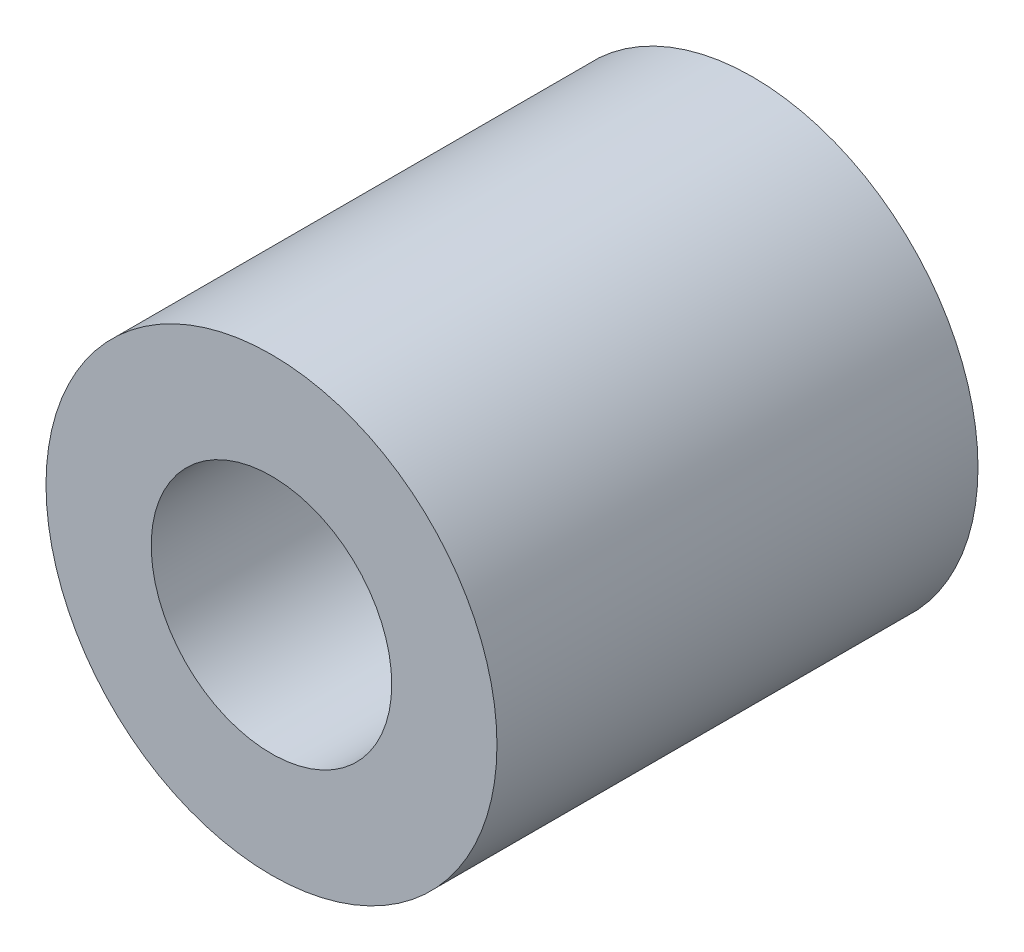
ISO-10303-21;
HEADER;
FILE_DESCRIPTION(('STEP AP214'),'2;1');
FILE_NAME('part.step','',(''),(''),'','','');
FILE_SCHEMA(('AUTOMOTIVE_DESIGN { 1 0 10303 214 1 1 1 1 }'));
ENDSEC;
DATA;
#1=APPLICATION_CONTEXT('core data for automotive mechanical design processes');
#2=APPLICATION_PROTOCOL_DEFINITION('international standard','automotive_design',2000,#1);
#3=PRODUCT_CONTEXT('',#1,'mechanical');
#4=PRODUCT('Part','Part','',(#3));
#5=PRODUCT_RELATED_PRODUCT_CATEGORY('part','',(#4));
#6=PRODUCT_DEFINITION_FORMATION('','',#4);
#7=PRODUCT_DEFINITION_CONTEXT('part definition',#1,'design');
#8=PRODUCT_DEFINITION('design','',#6,#7);
#9=PRODUCT_DEFINITION_SHAPE('','',#8);
#10=(LENGTH_UNIT() NAMED_UNIT(*) SI_UNIT(.MILLI.,.METRE.));
#11=(NAMED_UNIT(*) PLANE_ANGLE_UNIT() SI_UNIT($,.RADIAN.));
#12=(NAMED_UNIT(*) SI_UNIT($,.STERADIAN.) SOLID_ANGLE_UNIT());
#13=UNCERTAINTY_MEASURE_WITH_UNIT(LENGTH_MEASURE(1.E-05),#10,'distance_accuracy_value','');
#14=(GEOMETRIC_REPRESENTATION_CONTEXT(3) GLOBAL_UNCERTAINTY_ASSIGNED_CONTEXT((#13)) GLOBAL_UNIT_ASSIGNED_CONTEXT((#10,
#11,#12)) REPRESENTATION_CONTEXT('',''));
#15=CARTESIAN_POINT('',(0.,0.,0.));
#16=DIRECTION('',(0.,0.,1.));
#17=DIRECTION('',(1.,0.,0.));
#18=AXIS2_PLACEMENT_3D('',#15,#16,#17);
#19=CARTESIAN_POINT('',(0.,0.,16.));
#20=DIRECTION('',(0.,0.,1.));
#21=DIRECTION('',(1.,0.,0.));
#22=AXIS2_PLACEMENT_3D('',#19,#20,#21);
#23=PLANE('',#22);
#24=CARTESIAN_POINT('',(0.,0.,16.));
#25=DIRECTION('',(0.,0.,1.));
#26=DIRECTION('',(1.,0.,0.));
#27=AXIS2_PLACEMENT_3D('',#24,#25,#26);
#28=CIRCLE('',#27,7.5);
#29=CARTESIAN_POINT('',(7.5,0.,16.));
#30=VERTEX_POINT('',#29);
#31=EDGE_CURVE('E10',#30,#30,#28,.T.);
#32=ORIENTED_EDGE('',*,*,#31,.T.);
#33=EDGE_LOOP('',(#32));
#34=FACE_BOUND('',#33,.T.);
#35=CARTESIAN_POINT('',(0.,0.,16.));
#36=DIRECTION('',(0.,0.,1.));
#37=DIRECTION('',(1.,0.,0.));
#38=AXIS2_PLACEMENT_3D('',#35,#36,#37);
#39=CIRCLE('',#38,4.);
#40=CARTESIAN_POINT('',(4.,0.,16.));
#41=VERTEX_POINT('',#40);
#42=EDGE_CURVE('E45',#41,#41,#39,.T.);
#43=ORIENTED_EDGE('',*,*,#42,.F.);
#44=EDGE_LOOP('',(#43));
#45=FACE_BOUND('',#44,.T.);
#46=ADVANCED_FACE('F34',(#34,#45),#23,.T.);
#47=CARTESIAN_POINT('',(0.,0.,0.));
#48=DIRECTION('',(0.,0.,1.));
#49=DIRECTION('',(1.,0.,0.));
#50=AXIS2_PLACEMENT_3D('',#47,#48,#49);
#51=PLANE('',#50);
#52=CARTESIAN_POINT('',(0.,0.,0.));
#53=DIRECTION('',(0.,0.,1.));
#54=DIRECTION('',(1.,0.,0.));
#55=AXIS2_PLACEMENT_3D('',#52,#53,#54);
#56=CIRCLE('',#55,7.5);
#57=CARTESIAN_POINT('',(7.5,0.,0.));
#58=VERTEX_POINT('',#57);
#59=EDGE_CURVE('E38',#58,#58,#56,.T.);
#60=ORIENTED_EDGE('',*,*,#59,.F.);
#61=EDGE_LOOP('',(#60));
#62=FACE_BOUND('',#61,.T.);
#63=CARTESIAN_POINT('',(0.,0.,0.));
#64=DIRECTION('',(0.,0.,1.));
#65=DIRECTION('',(1.,0.,0.));
#66=AXIS2_PLACEMENT_3D('',#63,#64,#65);
#67=CIRCLE('',#66,4.);
#68=CARTESIAN_POINT('',(4.,0.,0.));
#69=VERTEX_POINT('',#68);
#70=EDGE_CURVE('E47',#69,#69,#67,.T.);
#71=ORIENTED_EDGE('',*,*,#70,.T.);
#72=EDGE_LOOP('',(#71));
#73=FACE_BOUND('',#72,.T.);
#74=ADVANCED_FACE('F57',(#62,#73),#51,.F.);
#75=CARTESIAN_POINT('',(0.,0.,16.));
#76=DIRECTION('',(0.,0.,-1.));
#77=DIRECTION('',(-1.,0.,0.));
#78=AXIS2_PLACEMENT_3D('',#75,#76,#77);
#79=CYLINDRICAL_SURFACE('',#78,7.5);
#80=ORIENTED_EDGE('',*,*,#31,.F.);
#81=EDGE_LOOP('',(#80));
#82=FACE_BOUND('',#81,.T.);
#83=ORIENTED_EDGE('',*,*,#59,.T.);
#84=EDGE_LOOP('',(#83));
#85=FACE_BOUND('',#84,.T.);
#86=ADVANCED_FACE('F36',(#82,#85),#79,.T.);
#87=CARTESIAN_POINT('',(0.,0.,16.));
#88=DIRECTION('',(0.,0.,-1.));
#89=DIRECTION('',(-1.,0.,0.));
#90=AXIS2_PLACEMENT_3D('',#87,#88,#89);
#91=CYLINDRICAL_SURFACE('',#90,4.);
#92=ORIENTED_EDGE('',*,*,#42,.T.);
#93=EDGE_LOOP('',(#92));
#94=FACE_BOUND('',#93,.T.);
#95=ORIENTED_EDGE('',*,*,#70,.F.);
#96=EDGE_LOOP('',(#95));
#97=FACE_BOUND('',#96,.T.);
#98=ADVANCED_FACE('F53',(#94,#97),#91,.F.);
#99=CLOSED_SHELL('',(#46,#74,#86,#98));
#100=MANIFOLD_SOLID_BREP('B2',#99);
#101=ADVANCED_BREP_SHAPE_REPRESENTATION('',(#18,#100),#14);
#102=SHAPE_DEFINITION_REPRESENTATION(#9,#101);
ENDSEC;
END-ISO-10303-21;
